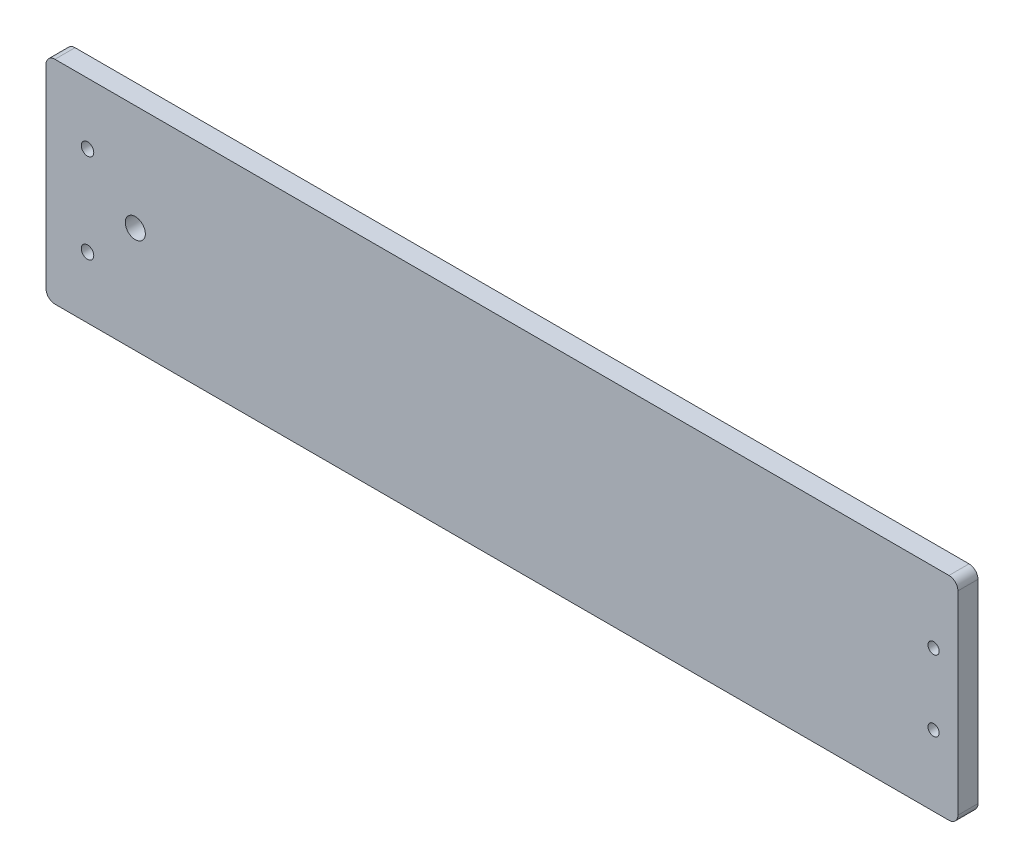
ISO-10303-21;
HEADER;
FILE_DESCRIPTION(('STEP AP214'),'2;1');
FILE_NAME('part.step','',(''),(''),'','','');
FILE_SCHEMA(('AUTOMOTIVE_DESIGN { 1 0 10303 214 1 1 1 1 }'));
ENDSEC;
DATA;
#1=APPLICATION_CONTEXT('core data for automotive mechanical design processes');
#2=APPLICATION_PROTOCOL_DEFINITION('international standard','automotive_design',2000,#1);
#3=PRODUCT_CONTEXT('',#1,'mechanical');
#4=PRODUCT('Part','Part','',(#3));
#5=PRODUCT_RELATED_PRODUCT_CATEGORY('part','',(#4));
#6=PRODUCT_DEFINITION_FORMATION('','',#4);
#7=PRODUCT_DEFINITION_CONTEXT('part definition',#1,'design');
#8=PRODUCT_DEFINITION('design','',#6,#7);
#9=PRODUCT_DEFINITION_SHAPE('','',#8);
#10=(LENGTH_UNIT() NAMED_UNIT(*) SI_UNIT(.MILLI.,.METRE.));
#11=(NAMED_UNIT(*) PLANE_ANGLE_UNIT() SI_UNIT($,.RADIAN.));
#12=(NAMED_UNIT(*) SI_UNIT($,.STERADIAN.) SOLID_ANGLE_UNIT());
#13=UNCERTAINTY_MEASURE_WITH_UNIT(LENGTH_MEASURE(1.E-05),#10,'distance_accuracy_value','');
#14=(GEOMETRIC_REPRESENTATION_CONTEXT(3) GLOBAL_UNCERTAINTY_ASSIGNED_CONTEXT((#13)) GLOBAL_UNIT_ASSIGNED_CONTEXT((#10,
#11,#12)) REPRESENTATION_CONTEXT('',''));
#15=CARTESIAN_POINT('',(0.,0.,0.));
#16=DIRECTION('',(0.,0.,1.));
#17=DIRECTION('',(1.,0.,0.));
#18=AXIS2_PLACEMENT_3D('',#15,#16,#17);
#19=CARTESIAN_POINT('',(0.,0.,2.25));
#20=DIRECTION('',(0.,0.,-1.));
#21=DIRECTION('',(-1.,0.,0.));
#22=AXIS2_PLACEMENT_3D('',#19,#20,#21);
#23=PLANE('',#22);
#24=CARTESIAN_POINT('',(96.6668749999996,7.93749999999994,2.25));
#25=DIRECTION('',(0.,0.,-1.));
#26=DIRECTION('',(-1.,0.,0.));
#27=AXIS2_PLACEMENT_3D('',#24,#25,#26);
#28=CIRCLE('',#27,1.25000003999999);
#29=CARTESIAN_POINT('',(95.4168749599996,7.93749999999994,2.25));
#30=VERTEX_POINT('',#29);
#31=EDGE_CURVE('E203',#30,#30,#28,.T.);
#32=ORIENTED_EDGE('',*,*,#31,.T.);
#33=EDGE_LOOP('',(#32));
#34=FACE_BOUND('',#33,.T.);
#35=CARTESIAN_POINT('',(96.6668749999996,-7.93750000000006,2.25));
#36=DIRECTION('',(0.,0.,-1.));
#37=DIRECTION('',(-1.,0.,0.));
#38=AXIS2_PLACEMENT_3D('',#35,#36,#37);
#39=CIRCLE('',#38,1.25000003999999);
#40=CARTESIAN_POINT('',(95.4168749599996,-7.93750000000006,2.25));
#41=VERTEX_POINT('',#40);
#42=EDGE_CURVE('E197',#41,#41,#39,.T.);
#43=ORIENTED_EDGE('',*,*,#42,.T.);
#44=EDGE_LOOP('',(#43));
#45=FACE_BOUND('',#44,.T.);
#46=CARTESIAN_POINT('',(-82.12,0.,2.25));
#47=DIRECTION('',(0.,0.,1.));
#48=DIRECTION('',(1.,0.,0.));
#49=AXIS2_PLACEMENT_3D('',#46,#47,#48);
#50=CIRCLE('',#49,2.2479);
#51=CARTESIAN_POINT('',(-79.8721,0.,2.25));
#52=VERTEX_POINT('',#51);
#53=EDGE_CURVE('E182',#52,#52,#50,.T.);
#54=ORIENTED_EDGE('',*,*,#53,.F.);
#55=EDGE_LOOP('',(#54));
#56=FACE_BOUND('',#55,.T.);
#57=DIRECTION('',(0.,-1.,0.));
#58=VECTOR('',#57,1.);
#59=CARTESIAN_POINT('',(-102.12,-23.75,2.25));
#60=LINE('',#59,#58);
#61=CARTESIAN_POINT('',(-102.12,21.75,2.25));
#62=VERTEX_POINT('',#61);
#63=CARTESIAN_POINT('',(-102.12,-21.75,2.25));
#64=VERTEX_POINT('',#63);
#65=EDGE_CURVE('E140',#62,#64,#60,.T.);
#66=ORIENTED_EDGE('',*,*,#65,.T.);
#67=CARTESIAN_POINT('',(-100.12,-21.75,2.25));
#68=DIRECTION('',(0.,0.,-1.));
#69=DIRECTION('',(-1.,0.,0.));
#70=AXIS2_PLACEMENT_3D('',#67,#68,#69);
#71=CIRCLE('',#70,2.);
#72=CARTESIAN_POINT('',(-100.12,-23.75,2.25));
#73=VERTEX_POINT('',#72);
#74=EDGE_CURVE('E155',#64,#73,#71,.F.);
#75=ORIENTED_EDGE('',*,*,#74,.T.);
#76=DIRECTION('',(1.,0.,0.));
#77=VECTOR('',#76,1.);
#78=CARTESIAN_POINT('',(-102.12,-23.75,2.25));
#79=LINE('',#78,#77);
#80=CARTESIAN_POINT('',(100.12,-23.75,2.25));
#81=VERTEX_POINT('',#80);
#82=EDGE_CURVE('E123',#73,#81,#79,.T.);
#83=ORIENTED_EDGE('',*,*,#82,.T.);
#84=CARTESIAN_POINT('',(100.12,-21.75,2.25));
#85=DIRECTION('',(0.,0.,-1.));
#86=DIRECTION('',(-1.,0.,0.));
#87=AXIS2_PLACEMENT_3D('',#84,#85,#86);
#88=CIRCLE('',#87,2.);
#89=CARTESIAN_POINT('',(102.12,-21.75,2.25));
#90=VERTEX_POINT('',#89);
#91=EDGE_CURVE('E153',#81,#90,#88,.F.);
#92=ORIENTED_EDGE('',*,*,#91,.T.);
#93=DIRECTION('',(0.,1.,0.));
#94=VECTOR('',#93,1.);
#95=CARTESIAN_POINT('',(102.12,-23.75,2.25));
#96=LINE('',#95,#94);
#97=CARTESIAN_POINT('',(102.12,21.75,2.25));
#98=VERTEX_POINT('',#97);
#99=EDGE_CURVE('E166',#90,#98,#96,.T.);
#100=ORIENTED_EDGE('',*,*,#99,.T.);
#101=CARTESIAN_POINT('',(100.12,21.75,2.25));
#102=DIRECTION('',(0.,0.,-1.));
#103=DIRECTION('',(-1.,0.,0.));
#104=AXIS2_PLACEMENT_3D('',#101,#102,#103);
#105=CIRCLE('',#104,2.);
#106=CARTESIAN_POINT('',(100.12,23.75,2.25));
#107=VERTEX_POINT('',#106);
#108=EDGE_CURVE('E58',#98,#107,#105,.F.);
#109=ORIENTED_EDGE('',*,*,#108,.T.);
#110=DIRECTION('',(-1.,0.,0.));
#111=VECTOR('',#110,1.);
#112=CARTESIAN_POINT('',(-102.12,23.75,2.25));
#113=LINE('',#112,#111);
#114=CARTESIAN_POINT('',(-100.12,23.75,2.25));
#115=VERTEX_POINT('',#114);
#116=EDGE_CURVE('E141',#107,#115,#113,.T.);
#117=ORIENTED_EDGE('',*,*,#116,.T.);
#118=CARTESIAN_POINT('',(-100.12,21.75,2.25));
#119=DIRECTION('',(0.,0.,-1.));
#120=DIRECTION('',(-1.,0.,0.));
#121=AXIS2_PLACEMENT_3D('',#118,#119,#120);
#122=CIRCLE('',#121,2.);
#123=EDGE_CURVE('E150',#115,#62,#122,.F.);
#124=ORIENTED_EDGE('',*,*,#123,.T.);
#125=EDGE_LOOP('',(#66,#75,#83,#92,#100,#109,#117,#124));
#126=FACE_BOUND('',#125,.T.);
#127=CARTESIAN_POINT('',(-92.82,-10.,2.25));
#128=DIRECTION('',(0.,0.,1.));
#129=DIRECTION('',(1.,0.,0.));
#130=AXIS2_PLACEMENT_3D('',#127,#128,#129);
#131=CIRCLE('',#130,1.397);
#132=CARTESIAN_POINT('',(-91.423,-10.,2.25));
#133=VERTEX_POINT('',#132);
#134=EDGE_CURVE('E188',#133,#133,#131,.T.);
#135=ORIENTED_EDGE('',*,*,#134,.F.);
#136=EDGE_LOOP('',(#135));
#137=FACE_BOUND('',#136,.T.);
#138=CARTESIAN_POINT('',(-92.82,9.99999999999997,2.25));
#139=DIRECTION('',(0.,0.,1.));
#140=DIRECTION('',(1.,0.,0.));
#141=AXIS2_PLACEMENT_3D('',#138,#139,#140);
#142=CIRCLE('',#141,1.397);
#143=CARTESIAN_POINT('',(-91.423,9.99999999999997,2.25));
#144=VERTEX_POINT('',#143);
#145=EDGE_CURVE('E194',#144,#144,#142,.T.);
#146=ORIENTED_EDGE('',*,*,#145,.F.);
#147=EDGE_LOOP('',(#146));
#148=FACE_BOUND('',#147,.T.);
#149=ADVANCED_FACE('F37',(#34,#45,#56,#126,#137,#148),#23,.F.);
#150=CARTESIAN_POINT('',(-102.12,-23.75,2.25));
#151=DIRECTION('',(1.,0.,0.));
#152=DIRECTION('',(0.,0.,-1.));
#153=AXIS2_PLACEMENT_3D('',#150,#151,#152);
#154=PLANE('',#153);
#155=DIRECTION('',(0.,-1.,0.));
#156=VECTOR('',#155,1.);
#157=CARTESIAN_POINT('',(-102.12,-23.75,-2.25));
#158=LINE('',#157,#156);
#159=CARTESIAN_POINT('',(-102.12,21.75,-2.25));
#160=VERTEX_POINT('',#159);
#161=CARTESIAN_POINT('',(-102.12,-21.75,-2.25));
#162=VERTEX_POINT('',#161);
#163=EDGE_CURVE('E130',#160,#162,#158,.T.);
#164=ORIENTED_EDGE('',*,*,#163,.T.);
#165=DIRECTION('',(0.,0.,-1.));
#166=VECTOR('',#165,1.);
#167=CARTESIAN_POINT('',(-102.12,-21.75,2.25));
#168=LINE('',#167,#166);
#169=EDGE_CURVE('E108',#162,#64,#168,.F.);
#170=ORIENTED_EDGE('',*,*,#169,.T.);
#171=ORIENTED_EDGE('',*,*,#65,.F.);
#172=DIRECTION('',(0.,0.,-1.));
#173=VECTOR('',#172,1.);
#174=CARTESIAN_POINT('',(-102.12,21.75,2.25));
#175=LINE('',#174,#173);
#176=EDGE_CURVE('E113',#62,#160,#175,.T.);
#177=ORIENTED_EDGE('',*,*,#176,.T.);
#178=EDGE_LOOP('',(#164,#170,#171,#177));
#179=FACE_BOUND('',#178,.T.);
#180=ADVANCED_FACE('F236',(#179),#154,.F.);
#181=CARTESIAN_POINT('',(-102.12,-23.75,2.25));
#182=DIRECTION('',(0.,1.,0.));
#183=DIRECTION('',(0.,0.,1.));
#184=AXIS2_PLACEMENT_3D('',#181,#182,#183);
#185=PLANE('',#184);
#186=ORIENTED_EDGE('',*,*,#82,.F.);
#187=DIRECTION('',(0.,0.,-1.));
#188=VECTOR('',#187,1.);
#189=CARTESIAN_POINT('',(-100.12,-23.75,2.25));
#190=LINE('',#189,#188);
#191=CARTESIAN_POINT('',(-100.12,-23.75,-2.25));
#192=VERTEX_POINT('',#191);
#193=EDGE_CURVE('E107',#73,#192,#190,.T.);
#194=ORIENTED_EDGE('',*,*,#193,.T.);
#195=DIRECTION('',(1.,0.,0.));
#196=VECTOR('',#195,1.);
#197=CARTESIAN_POINT('',(-102.12,-23.75,-2.25));
#198=LINE('',#197,#196);
#199=CARTESIAN_POINT('',(100.12,-23.75,-2.25));
#200=VERTEX_POINT('',#199);
#201=EDGE_CURVE('E120',#192,#200,#198,.T.);
#202=ORIENTED_EDGE('',*,*,#201,.T.);
#203=DIRECTION('',(0.,0.,-1.));
#204=VECTOR('',#203,1.);
#205=CARTESIAN_POINT('',(100.12,-23.75,2.25));
#206=LINE('',#205,#204);
#207=EDGE_CURVE('E125',#200,#81,#206,.F.);
#208=ORIENTED_EDGE('',*,*,#207,.T.);
#209=EDGE_LOOP('',(#186,#194,#202,#208));
#210=FACE_BOUND('',#209,.T.);
#211=ADVANCED_FACE('F119',(#210),#185,.F.);
#212=CARTESIAN_POINT('',(102.12,-23.75,2.25));
#213=DIRECTION('',(-1.,0.,0.));
#214=DIRECTION('',(0.,0.,1.));
#215=AXIS2_PLACEMENT_3D('',#212,#213,#214);
#216=PLANE('',#215);
#217=ORIENTED_EDGE('',*,*,#99,.F.);
#218=DIRECTION('',(0.,0.,-1.));
#219=VECTOR('',#218,1.);
#220=CARTESIAN_POINT('',(102.12,-21.75,2.25));
#221=LINE('',#220,#219);
#222=CARTESIAN_POINT('',(102.12,-21.75,-2.25));
#223=VERTEX_POINT('',#222);
#224=EDGE_CURVE('E159',#90,#223,#221,.T.);
#225=ORIENTED_EDGE('',*,*,#224,.T.);
#226=DIRECTION('',(0.,1.,0.));
#227=VECTOR('',#226,1.);
#228=CARTESIAN_POINT('',(102.12,-23.75,-2.25));
#229=LINE('',#228,#227);
#230=CARTESIAN_POINT('',(102.12,21.75,-2.25));
#231=VERTEX_POINT('',#230);
#232=EDGE_CURVE('E129',#223,#231,#229,.T.);
#233=ORIENTED_EDGE('',*,*,#232,.T.);
#234=DIRECTION('',(0.,0.,-1.));
#235=VECTOR('',#234,1.);
#236=CARTESIAN_POINT('',(102.12,21.75,2.25));
#237=LINE('',#236,#235);
#238=EDGE_CURVE('E157',#231,#98,#237,.F.);
#239=ORIENTED_EDGE('',*,*,#238,.T.);
#240=EDGE_LOOP('',(#217,#225,#233,#239));
#241=FACE_BOUND('',#240,.T.);
#242=ADVANCED_FACE('F164',(#241),#216,.F.);
#243=CARTESIAN_POINT('',(-102.12,23.75,2.25));
#244=DIRECTION('',(0.,-1.,0.));
#245=DIRECTION('',(0.,0.,-1.));
#246=AXIS2_PLACEMENT_3D('',#243,#244,#245);
#247=PLANE('',#246);
#248=ORIENTED_EDGE('',*,*,#116,.F.);
#249=DIRECTION('',(0.,0.,-1.));
#250=VECTOR('',#249,1.);
#251=CARTESIAN_POINT('',(100.12,23.75,2.25));
#252=LINE('',#251,#250);
#253=CARTESIAN_POINT('',(100.12,23.75,-2.25));
#254=VERTEX_POINT('',#253);
#255=EDGE_CURVE('E11',#107,#254,#252,.T.);
#256=ORIENTED_EDGE('',*,*,#255,.T.);
#257=DIRECTION('',(-1.,0.,0.));
#258=VECTOR('',#257,1.);
#259=CARTESIAN_POINT('',(-102.12,23.75,-2.25));
#260=LINE('',#259,#258);
#261=CARTESIAN_POINT('',(-100.12,23.75,-2.25));
#262=VERTEX_POINT('',#261);
#263=EDGE_CURVE('E133',#254,#262,#260,.T.);
#264=ORIENTED_EDGE('',*,*,#263,.T.);
#265=DIRECTION('',(0.,0.,-1.));
#266=VECTOR('',#265,1.);
#267=CARTESIAN_POINT('',(-100.12,23.75,2.25));
#268=LINE('',#267,#266);
#269=EDGE_CURVE('E45',#262,#115,#268,.F.);
#270=ORIENTED_EDGE('',*,*,#269,.T.);
#271=EDGE_LOOP('',(#248,#256,#264,#270));
#272=FACE_BOUND('',#271,.T.);
#273=ADVANCED_FACE('F173',(#272),#247,.F.);
#274=CARTESIAN_POINT('',(0.,0.,-2.25));
#275=DIRECTION('',(0.,0.,-1.));
#276=DIRECTION('',(-1.,0.,0.));
#277=AXIS2_PLACEMENT_3D('',#274,#275,#276);
#278=PLANE('',#277);
#279=CARTESIAN_POINT('',(96.6668749999996,7.93749999999994,-2.25));
#280=DIRECTION('',(0.,0.,-1.));
#281=DIRECTION('',(-1.,0.,0.));
#282=AXIS2_PLACEMENT_3D('',#279,#280,#281);
#283=CIRCLE('',#282,1.25000003999999);
#284=CARTESIAN_POINT('',(95.4168749599996,7.93749999999994,-2.25));
#285=VERTEX_POINT('',#284);
#286=EDGE_CURVE('E206',#285,#285,#283,.T.);
#287=ORIENTED_EDGE('',*,*,#286,.F.);
#288=EDGE_LOOP('',(#287));
#289=FACE_BOUND('',#288,.T.);
#290=CARTESIAN_POINT('',(96.6668749999996,-7.93750000000006,-2.25));
#291=DIRECTION('',(0.,0.,-1.));
#292=DIRECTION('',(-1.,0.,0.));
#293=AXIS2_PLACEMENT_3D('',#290,#291,#292);
#294=CIRCLE('',#293,1.25000003999999);
#295=CARTESIAN_POINT('',(95.4168749599996,-7.93750000000006,-2.25));
#296=VERTEX_POINT('',#295);
#297=EDGE_CURVE('E200',#296,#296,#294,.T.);
#298=ORIENTED_EDGE('',*,*,#297,.F.);
#299=EDGE_LOOP('',(#298));
#300=FACE_BOUND('',#299,.T.);
#301=CARTESIAN_POINT('',(-92.82,9.99999999999997,-2.25));
#302=DIRECTION('',(0.,0.,-1.));
#303=DIRECTION('',(-1.,0.,0.));
#304=AXIS2_PLACEMENT_3D('',#301,#302,#303);
#305=CIRCLE('',#304,1.397);
#306=CARTESIAN_POINT('',(-94.217,9.99999999999997,-2.25));
#307=VERTEX_POINT('',#306);
#308=EDGE_CURVE('E191',#307,#307,#305,.T.);
#309=ORIENTED_EDGE('',*,*,#308,.F.);
#310=EDGE_LOOP('',(#309));
#311=FACE_BOUND('',#310,.T.);
#312=CARTESIAN_POINT('',(-92.82,-10.,-2.25));
#313=DIRECTION('',(0.,0.,-1.));
#314=DIRECTION('',(-1.,0.,0.));
#315=AXIS2_PLACEMENT_3D('',#312,#313,#314);
#316=CIRCLE('',#315,1.397);
#317=CARTESIAN_POINT('',(-94.217,-10.,-2.25));
#318=VERTEX_POINT('',#317);
#319=EDGE_CURVE('E185',#318,#318,#316,.T.);
#320=ORIENTED_EDGE('',*,*,#319,.F.);
#321=EDGE_LOOP('',(#320));
#322=FACE_BOUND('',#321,.T.);
#323=CARTESIAN_POINT('',(-82.12,0.,-2.25));
#324=DIRECTION('',(0.,0.,-1.));
#325=DIRECTION('',(-1.,0.,0.));
#326=AXIS2_PLACEMENT_3D('',#323,#324,#325);
#327=CIRCLE('',#326,2.2479);
#328=CARTESIAN_POINT('',(-84.3679,0.,-2.25));
#329=VERTEX_POINT('',#328);
#330=EDGE_CURVE('E135',#329,#329,#327,.T.);
#331=ORIENTED_EDGE('',*,*,#330,.F.);
#332=EDGE_LOOP('',(#331));
#333=FACE_BOUND('',#332,.T.);
#334=ORIENTED_EDGE('',*,*,#201,.F.);
#335=CARTESIAN_POINT('',(-100.12,-21.75,-2.25));
#336=DIRECTION('',(0.,0.,-1.));
#337=DIRECTION('',(-1.,0.,0.));
#338=AXIS2_PLACEMENT_3D('',#335,#336,#337);
#339=CIRCLE('',#338,2.);
#340=EDGE_CURVE('E103',#192,#162,#339,.T.);
#341=ORIENTED_EDGE('',*,*,#340,.T.);
#342=ORIENTED_EDGE('',*,*,#163,.F.);
#343=CARTESIAN_POINT('',(-100.12,21.75,-2.25));
#344=DIRECTION('',(0.,0.,-1.));
#345=DIRECTION('',(-1.,0.,0.));
#346=AXIS2_PLACEMENT_3D('',#343,#344,#345);
#347=CIRCLE('',#346,2.);
#348=EDGE_CURVE('E124',#160,#262,#347,.T.);
#349=ORIENTED_EDGE('',*,*,#348,.T.);
#350=ORIENTED_EDGE('',*,*,#263,.F.);
#351=CARTESIAN_POINT('',(100.12,21.75,-2.25));
#352=DIRECTION('',(0.,0.,-1.));
#353=DIRECTION('',(-1.,0.,0.));
#354=AXIS2_PLACEMENT_3D('',#351,#352,#353);
#355=CIRCLE('',#354,2.);
#356=EDGE_CURVE('E144',#254,#231,#355,.T.);
#357=ORIENTED_EDGE('',*,*,#356,.T.);
#358=ORIENTED_EDGE('',*,*,#232,.F.);
#359=CARTESIAN_POINT('',(100.12,-21.75,-2.25));
#360=DIRECTION('',(0.,0.,-1.));
#361=DIRECTION('',(-1.,0.,0.));
#362=AXIS2_PLACEMENT_3D('',#359,#360,#361);
#363=CIRCLE('',#362,2.);
#364=EDGE_CURVE('E114',#223,#200,#363,.T.);
#365=ORIENTED_EDGE('',*,*,#364,.T.);
#366=EDGE_LOOP('',(#334,#341,#342,#349,#350,#357,#358,#365));
#367=FACE_BOUND('',#366,.T.);
#368=ADVANCED_FACE('F127',(#289,#300,#311,#322,#333,#367),#278,.T.);
#369=CARTESIAN_POINT('',(-82.12,0.,2.25));
#370=DIRECTION('',(0.,0.,1.));
#371=DIRECTION('',(1.,0.,0.));
#372=AXIS2_PLACEMENT_3D('',#369,#370,#371);
#373=CYLINDRICAL_SURFACE('',#372,2.2479);
#374=ORIENTED_EDGE('',*,*,#53,.T.);
#375=EDGE_LOOP('',(#374));
#376=FACE_BOUND('',#375,.T.);
#377=ORIENTED_EDGE('',*,*,#330,.T.);
#378=EDGE_LOOP('',(#377));
#379=FACE_BOUND('',#378,.T.);
#380=ADVANCED_FACE('F215',(#376,#379),#373,.F.);
#381=CARTESIAN_POINT('',(-100.12,-21.75,2.25));
#382=DIRECTION('',(0.,0.,-1.));
#383=DIRECTION('',(-1.,0.,0.));
#384=AXIS2_PLACEMENT_3D('',#381,#382,#383);
#385=CYLINDRICAL_SURFACE('',#384,2.);
#386=ORIENTED_EDGE('',*,*,#74,.F.);
#387=ORIENTED_EDGE('',*,*,#169,.F.);
#388=ORIENTED_EDGE('',*,*,#340,.F.);
#389=ORIENTED_EDGE('',*,*,#193,.F.);
#390=EDGE_LOOP('',(#386,#387,#388,#389));
#391=FACE_BOUND('',#390,.T.);
#392=ADVANCED_FACE('F106',(#391),#385,.T.);
#393=CARTESIAN_POINT('',(100.12,-21.75,2.25));
#394=DIRECTION('',(0.,0.,-1.));
#395=DIRECTION('',(-1.,0.,0.));
#396=AXIS2_PLACEMENT_3D('',#393,#394,#395);
#397=CYLINDRICAL_SURFACE('',#396,2.);
#398=ORIENTED_EDGE('',*,*,#91,.F.);
#399=ORIENTED_EDGE('',*,*,#207,.F.);
#400=ORIENTED_EDGE('',*,*,#364,.F.);
#401=ORIENTED_EDGE('',*,*,#224,.F.);
#402=EDGE_LOOP('',(#398,#399,#400,#401));
#403=FACE_BOUND('',#402,.T.);
#404=ADVANCED_FACE('F231',(#403),#397,.T.);
#405=CARTESIAN_POINT('',(100.12,21.75,2.25));
#406=DIRECTION('',(0.,0.,-1.));
#407=DIRECTION('',(-1.,0.,0.));
#408=AXIS2_PLACEMENT_3D('',#405,#406,#407);
#409=CYLINDRICAL_SURFACE('',#408,2.);
#410=ORIENTED_EDGE('',*,*,#108,.F.);
#411=ORIENTED_EDGE('',*,*,#238,.F.);
#412=ORIENTED_EDGE('',*,*,#356,.F.);
#413=ORIENTED_EDGE('',*,*,#255,.F.);
#414=EDGE_LOOP('',(#410,#411,#412,#413));
#415=FACE_BOUND('',#414,.T.);
#416=ADVANCED_FACE('F172',(#415),#409,.T.);
#417=CARTESIAN_POINT('',(-100.12,21.75,2.25));
#418=DIRECTION('',(0.,0.,-1.));
#419=DIRECTION('',(-1.,0.,0.));
#420=AXIS2_PLACEMENT_3D('',#417,#418,#419);
#421=CYLINDRICAL_SURFACE('',#420,2.);
#422=ORIENTED_EDGE('',*,*,#123,.F.);
#423=ORIENTED_EDGE('',*,*,#269,.F.);
#424=ORIENTED_EDGE('',*,*,#348,.F.);
#425=ORIENTED_EDGE('',*,*,#176,.F.);
#426=EDGE_LOOP('',(#422,#423,#424,#425));
#427=FACE_BOUND('',#426,.T.);
#428=ADVANCED_FACE('F39',(#427),#421,.T.);
#429=CARTESIAN_POINT('',(-92.82,-10.,2.25));
#430=DIRECTION('',(0.,0.,1.));
#431=DIRECTION('',(1.,0.,0.));
#432=AXIS2_PLACEMENT_3D('',#429,#430,#431);
#433=CYLINDRICAL_SURFACE('',#432,1.397);
#434=ORIENTED_EDGE('',*,*,#134,.T.);
#435=EDGE_LOOP('',(#434));
#436=FACE_BOUND('',#435,.T.);
#437=ORIENTED_EDGE('',*,*,#319,.T.);
#438=EDGE_LOOP('',(#437));
#439=FACE_BOUND('',#438,.T.);
#440=ADVANCED_FACE('F256',(#436,#439),#433,.F.);
#441=CARTESIAN_POINT('',(-92.82,9.99999999999997,2.25));
#442=DIRECTION('',(0.,0.,1.));
#443=DIRECTION('',(1.,0.,0.));
#444=AXIS2_PLACEMENT_3D('',#441,#442,#443);
#445=CYLINDRICAL_SURFACE('',#444,1.397);
#446=ORIENTED_EDGE('',*,*,#145,.T.);
#447=EDGE_LOOP('',(#446));
#448=FACE_BOUND('',#447,.T.);
#449=ORIENTED_EDGE('',*,*,#308,.T.);
#450=EDGE_LOOP('',(#449));
#451=FACE_BOUND('',#450,.T.);
#452=ADVANCED_FACE('F261',(#448,#451),#445,.F.);
#453=CARTESIAN_POINT('',(96.6668749999996,-7.93750000000006,-2.25));
#454=DIRECTION('',(0.,0.,-1.));
#455=DIRECTION('',(-1.,0.,0.));
#456=AXIS2_PLACEMENT_3D('',#453,#454,#455);
#457=CYLINDRICAL_SURFACE('',#456,1.25000003999999);
#458=ORIENTED_EDGE('',*,*,#297,.T.);
#459=EDGE_LOOP('',(#458));
#460=FACE_BOUND('',#459,.T.);
#461=ORIENTED_EDGE('',*,*,#42,.F.);
#462=EDGE_LOOP('',(#461));
#463=FACE_BOUND('',#462,.T.);
#464=ADVANCED_FACE('F272',(#460,#463),#457,.F.);
#465=CARTESIAN_POINT('',(96.6668749999996,7.93749999999994,-2.25));
#466=DIRECTION('',(0.,0.,-1.));
#467=DIRECTION('',(-1.,0.,0.));
#468=AXIS2_PLACEMENT_3D('',#465,#466,#467);
#469=CYLINDRICAL_SURFACE('',#468,1.25000003999999);
#470=ORIENTED_EDGE('',*,*,#286,.T.);
#471=EDGE_LOOP('',(#470));
#472=FACE_BOUND('',#471,.T.);
#473=ORIENTED_EDGE('',*,*,#31,.F.);
#474=EDGE_LOOP('',(#473));
#475=FACE_BOUND('',#474,.T.);
#476=ADVANCED_FACE('F210',(#472,#475),#469,.F.);
#477=CLOSED_SHELL('',(#149,#180,#211,#242,#273,#368,#380,#392,#404,#416,#428,#440,#452,#464,#476));
#478=MANIFOLD_SOLID_BREP('B2',#477);
#479=ADVANCED_BREP_SHAPE_REPRESENTATION('',(#18,#478),#14);
#480=SHAPE_DEFINITION_REPRESENTATION(#9,#479);
ENDSEC;
END-ISO-10303-21;
